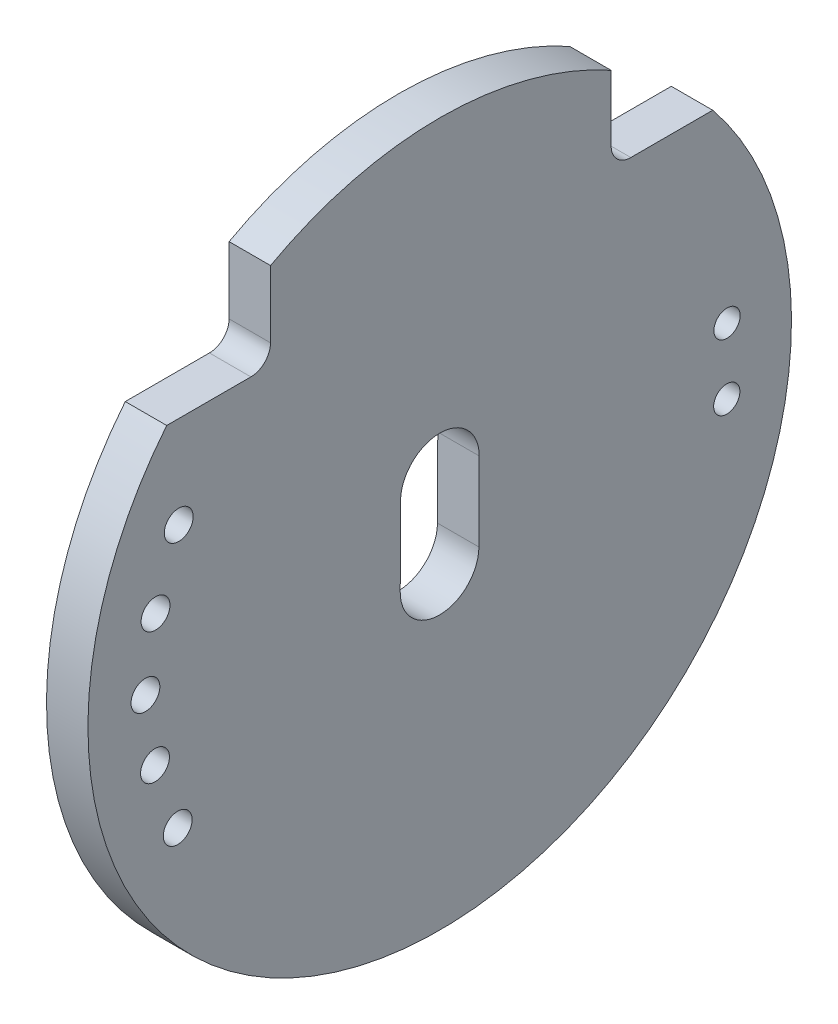
ISO-10303-21;
HEADER;
FILE_DESCRIPTION(('STEP AP214'),'2;1');
FILE_NAME('part.step','',(''),(''),'','','');
FILE_SCHEMA(('AUTOMOTIVE_DESIGN { 1 0 10303 214 1 1 1 1 }'));
ENDSEC;
DATA;
#1=APPLICATION_CONTEXT('core data for automotive mechanical design processes');
#2=APPLICATION_PROTOCOL_DEFINITION('international standard','automotive_design',2000,#1);
#3=PRODUCT_CONTEXT('',#1,'mechanical');
#4=PRODUCT('Part','Part','',(#3));
#5=PRODUCT_RELATED_PRODUCT_CATEGORY('part','',(#4));
#6=PRODUCT_DEFINITION_FORMATION('','',#4);
#7=PRODUCT_DEFINITION_CONTEXT('part definition',#1,'design');
#8=PRODUCT_DEFINITION('design','',#6,#7);
#9=PRODUCT_DEFINITION_SHAPE('','',#8);
#10=(LENGTH_UNIT() NAMED_UNIT(*) SI_UNIT(.MILLI.,.METRE.));
#11=(NAMED_UNIT(*) PLANE_ANGLE_UNIT() SI_UNIT($,.RADIAN.));
#12=(NAMED_UNIT(*) SI_UNIT($,.STERADIAN.) SOLID_ANGLE_UNIT());
#13=UNCERTAINTY_MEASURE_WITH_UNIT(LENGTH_MEASURE(1.E-05),#10,'distance_accuracy_value','');
#14=(GEOMETRIC_REPRESENTATION_CONTEXT(3) GLOBAL_UNCERTAINTY_ASSIGNED_CONTEXT((#13)) GLOBAL_UNIT_ASSIGNED_CONTEXT((#10,
#11,#12)) REPRESENTATION_CONTEXT('',''));
#15=CARTESIAN_POINT('',(0.,0.,0.));
#16=DIRECTION('',(0.,0.,1.));
#17=DIRECTION('',(1.,0.,0.));
#18=AXIS2_PLACEMENT_3D('',#15,#16,#17);
#19=CARTESIAN_POINT('',(0.,7.12627906861784,-7.18724294493581));
#20=DIRECTION('',(1.,0.,0.));
#21=DIRECTION('',(0.,0.135231072620531,-0.990814088009401));
#22=AXIS2_PLACEMENT_3D('',#19,#20,#21);
#23=PLANE('',#22);
#24=CARTESIAN_POINT('',(0.,2.5138076662489,5.05504994051893));
#25=DIRECTION('',(-1.,0.,0.));
#26=DIRECTION('',(0.,-0.135231072620531,0.990814088009401));
#27=AXIS2_PLACEMENT_3D('',#24,#25,#26);
#28=CIRCLE('',#27,0.2794);
#29=CARTESIAN_POINT('',(0.,2.47602410455872,5.33188339670876));
#30=VERTEX_POINT('',#29);
#31=EDGE_CURVE('E157',#30,#30,#28,.T.);
#32=ORIENTED_EDGE('',*,*,#31,.T.);
#33=EDGE_LOOP('',(#32));
#34=FACE_BOUND('',#33,.T.);
#35=CARTESIAN_POINT('',(0.,-0.682532004767782,-5.55992778572417));
#36=DIRECTION('',(-1.,0.,0.));
#37=DIRECTION('',(0.,-0.135231072620531,0.990814088009401));
#38=AXIS2_PLACEMENT_3D('',#35,#36,#37);
#39=CIRCLE('',#38,0.254);
#40=CARTESIAN_POINT('',(0.,-0.716880697213397,-5.30826100736978));
#41=VERTEX_POINT('',#40);
#42=EDGE_CURVE('E154',#41,#41,#39,.T.);
#43=ORIENTED_EDGE('',*,*,#42,.T.);
#44=EDGE_LOOP('',(#43));
#45=FACE_BOUND('',#44,.T.);
#46=CARTESIAN_POINT('',(0.,0.58745793827718,-5.56498194882563));
#47=DIRECTION('',(-1.,0.,0.));
#48=DIRECTION('',(0.,-0.135231072620531,0.990814088009401));
#49=AXIS2_PLACEMENT_3D('',#46,#47,#48);
#50=CIRCLE('',#49,0.254);
#51=CARTESIAN_POINT('',(0.,0.553109245831565,-5.31331517047124));
#52=VERTEX_POINT('',#51);
#53=EDGE_CURVE('E151',#52,#52,#50,.T.);
#54=ORIENTED_EDGE('',*,*,#53,.T.);
#55=EDGE_LOOP('',(#54));
#56=FACE_BOUND('',#55,.T.);
#57=CARTESIAN_POINT('',(0.,1.25193663000467,5.50457531287063));
#58=DIRECTION('',(-1.,0.,0.));
#59=DIRECTION('',(0.,-0.135231072620531,0.990814088009401));
#60=AXIS2_PLACEMENT_3D('',#57,#58,#59);
#61=CIRCLE('',#60,0.2794);
#62=CARTESIAN_POINT('',(0.,1.21415306831449,5.78140876906046));
#63=VERTEX_POINT('',#62);
#64=EDGE_CURVE('E148',#63,#63,#61,.T.);
#65=ORIENTED_EDGE('',*,*,#64,.T.);
#66=EDGE_LOOP('',(#65));
#67=FACE_BOUND('',#66,.T.);
#68=CARTESIAN_POINT('',(0.,-0.0172951885750744,5.70012796742883));
#69=DIRECTION('',(-1.,0.,0.));
#70=DIRECTION('',(0.,-0.135231072620531,0.990814088009401));
#71=AXIS2_PLACEMENT_3D('',#68,#69,#70);
#72=CIRCLE('',#71,0.2794);
#73=CARTESIAN_POINT('',(0.,-0.0550787502652509,5.97696142361866));
#74=VERTEX_POINT('',#73);
#75=EDGE_CURVE('E145',#74,#74,#72,.T.);
#76=ORIENTED_EDGE('',*,*,#75,.T.);
#77=EDGE_LOOP('',(#76));
#78=FACE_BOUND('',#77,.T.);
#79=CARTESIAN_POINT('',(0.,-2.55980215621573,5.07524132210927));
#80=DIRECTION('',(-1.,0.,0.));
#81=DIRECTION('',(0.,-0.135231072620531,0.990814088009401));
#82=AXIS2_PLACEMENT_3D('',#79,#80,#81);
#83=CIRCLE('',#82,0.2794);
#84=CARTESIAN_POINT('',(0.,-2.59758571790591,5.3520747782991));
#85=VERTEX_POINT('',#84);
#86=EDGE_CURVE('E142',#85,#85,#83,.T.);
#87=ORIENTED_EDGE('',*,*,#86,.T.);
#88=EDGE_LOOP('',(#87));
#89=FACE_BOUND('',#88,.T.);
#90=CARTESIAN_POINT('',(0.,-1.28804325608525,5.51468363907355));
#91=DIRECTION('',(-1.,0.,0.));
#92=DIRECTION('',(0.,-0.135231072620531,0.990814088009401));
#93=AXIS2_PLACEMENT_3D('',#90,#91,#92);
#94=CIRCLE('',#93,0.2794);
#95=CARTESIAN_POINT('',(0.,-1.32582681777543,5.79151709526338));
#96=VERTEX_POINT('',#95);
#97=EDGE_CURVE('E139',#96,#96,#94,.T.);
#98=ORIENTED_EDGE('',*,*,#97,.T.);
#99=EDGE_LOOP('',(#98));
#100=FACE_BOUND('',#99,.T.);
#101=CARTESIAN_POINT('',(0.,-0.761993965826976,0.00303249786087756));
#102=DIRECTION('',(-1.,0.,0.));
#103=DIRECTION('',(0.,-0.135231072620531,0.990814088009401));
#104=AXIS2_PLACEMENT_3D('',#101,#102,#103);
#105=CIRCLE('',#104,0.762);
#106=CARTESIAN_POINT('',(0.,-0.765026463687854,-0.758961467966099));
#107=VERTEX_POINT('',#106);
#108=CARTESIAN_POINT('',(0.,-0.758961467966099,0.765026463687854));
#109=VERTEX_POINT('',#108);
#110=EDGE_CURVE('E124',#107,#109,#105,.T.);
#111=ORIENTED_EDGE('',*,*,#110,.T.);
#112=DIRECTION('',(0.,0.999992081137765,-0.00397965598540282));
#113=VECTOR('',#112,1.);
#114=CARTESIAN_POINT('',(0.,0.803129311954259,0.758809830537141));
#115=LINE('',#114,#113);
#116=CARTESIAN_POINT('',(0.,0.765026463687856,0.758961467966101));
#117=VERTEX_POINT('',#116);
#118=EDGE_CURVE('E203',#117,#109,#115,.F.);
#119=ORIENTED_EDGE('',*,*,#118,.F.);
#120=CARTESIAN_POINT('',(0.,0.761993965826978,-0.00303249786087713));
#121=DIRECTION('',(-1.,0.,0.));
#122=DIRECTION('',(0.,-0.135231072620531,0.990814088009401));
#123=AXIS2_PLACEMENT_3D('',#120,#121,#122);
#124=CIRCLE('',#123,0.762);
#125=CARTESIAN_POINT('',(0.,0.758961467966101,-0.765026463687852));
#126=VERTEX_POINT('',#125);
#127=EDGE_CURVE('E161',#117,#126,#124,.T.);
#128=ORIENTED_EDGE('',*,*,#127,.T.);
#129=DIRECTION('',(0.,-0.999992081137765,0.00397965598540284));
#130=VECTOR('',#129,1.);
#131=CARTESIAN_POINT('',(0.,-0.803129311954257,-0.758809830537139));
#132=LINE('',#131,#130);
#133=EDGE_CURVE('E164',#107,#126,#132,.F.);
#134=ORIENTED_EDGE('',*,*,#133,.F.);
#135=EDGE_LOOP('',(#111,#119,#128,#134));
#136=FACE_BOUND('',#135,.T.);
#137=CARTESIAN_POINT('',(0.,0.,0.));
#138=DIRECTION('',(1.,0.,0.));
#139=DIRECTION('',(0.,0.,-1.));
#140=AXIS2_PLACEMENT_3D('',#137,#138,#139);
#141=CIRCLE('',#140,6.81392592);
#142=CARTESIAN_POINT('',(0.,4.29704157111282,5.28819630681163));
#143=VERTEX_POINT('',#142);
#144=CARTESIAN_POINT('',(0.,4.29704157111281,-5.28819630681163));
#145=VERTEX_POINT('',#144);
#146=EDGE_CURVE('E178',#143,#145,#141,.T.);
#147=ORIENTED_EDGE('',*,*,#146,.T.);
#148=DIRECTION('',(0.,0.,1.));
#149=VECTOR('',#148,1.);
#150=CARTESIAN_POINT('',(0.,4.29704157111281,-7.18724294493581));
#151=LINE('',#150,#149);
#152=CARTESIAN_POINT('',(0.,4.29704157111282,-3.70147208886825));
#153=VERTEX_POINT('',#152);
#154=EDGE_CURVE('E201',#145,#153,#151,.T.);
#155=ORIENTED_EDGE('',*,*,#154,.T.);
#156=CARTESIAN_POINT('',(0.,4.67804157111282,-3.70147208886825));
#157=DIRECTION('',(1.,0.,0.));
#158=DIRECTION('',(0.,0.,-1.));
#159=AXIS2_PLACEMENT_3D('',#156,#157,#158);
#160=CIRCLE('',#159,0.381);
#161=CARTESIAN_POINT('',(0.,4.67804157111282,-3.32047208886825));
#162=VERTEX_POINT('',#161);
#163=EDGE_CURVE('E11',#153,#162,#160,.F.);
#164=ORIENTED_EDGE('',*,*,#163,.T.);
#165=DIRECTION('',(0.,1.,0.));
#166=VECTOR('',#165,1.);
#167=CARTESIAN_POINT('',(0.,7.12627906861784,-3.32047208886825));
#168=LINE('',#167,#166);
#169=CARTESIAN_POINT('',(0.,5.95013038094921,-3.32047208886825));
#170=VERTEX_POINT('',#169);
#171=EDGE_CURVE('E204',#162,#170,#168,.T.);
#172=ORIENTED_EDGE('',*,*,#171,.T.);
#173=CARTESIAN_POINT('',(0.,0.,0.));
#174=DIRECTION('',(1.,0.,0.));
#175=DIRECTION('',(0.,0.,-1.));
#176=AXIS2_PLACEMENT_3D('',#173,#174,#175);
#177=CIRCLE('',#176,6.81392592);
#178=CARTESIAN_POINT('',(0.,5.97417912716733,3.27700628619568));
#179=VERTEX_POINT('',#178);
#180=EDGE_CURVE('E196',#170,#179,#177,.T.);
#181=ORIENTED_EDGE('',*,*,#180,.T.);
#182=DIRECTION('',(0.,-1.,0.));
#183=VECTOR('',#182,1.);
#184=CARTESIAN_POINT('',(0.,7.12627906861784,3.27700628619568));
#185=LINE('',#184,#183);
#186=CARTESIAN_POINT('',(0.,4.67804157111282,3.27700628619568));
#187=VERTEX_POINT('',#186);
#188=EDGE_CURVE('E193',#179,#187,#185,.T.);
#189=ORIENTED_EDGE('',*,*,#188,.T.);
#190=CARTESIAN_POINT('',(0.,4.67804157111282,3.65800628619568));
#191=DIRECTION('',(1.,0.,0.));
#192=DIRECTION('',(0.,0.,-1.));
#193=AXIS2_PLACEMENT_3D('',#190,#191,#192);
#194=CIRCLE('',#193,0.381);
#195=CARTESIAN_POINT('',(0.,4.29704157111282,3.65800628619568));
#196=VERTEX_POINT('',#195);
#197=EDGE_CURVE('E220',#187,#196,#194,.F.);
#198=ORIENTED_EDGE('',*,*,#197,.T.);
#199=DIRECTION('',(0.,0.,1.));
#200=VECTOR('',#199,1.);
#201=CARTESIAN_POINT('',(0.,4.29704157111282,-7.18724294493581));
#202=LINE('',#201,#200);
#203=EDGE_CURVE('E197',#196,#143,#202,.T.);
#204=ORIENTED_EDGE('',*,*,#203,.T.);
#205=EDGE_LOOP('',(#147,#155,#164,#172,#181,#189,#198,#204));
#206=FACE_BOUND('',#205,.T.);
#207=ADVANCED_FACE('F17',(#34,#45,#56,#67,#78,#89,#100,#136,#206),#23,.T.);
#208=CARTESIAN_POINT('',(-0.80264,7.12627906861784,-7.18724294493581));
#209=DIRECTION('',(1.,0.,0.));
#210=DIRECTION('',(0.,0.135231072620531,-0.990814088009401));
#211=AXIS2_PLACEMENT_3D('',#208,#209,#210);
#212=PLANE('',#211);
#213=CARTESIAN_POINT('',(-0.80264,0.761993965826978,-0.00303249786087713));
#214=DIRECTION('',(-1.,0.,0.));
#215=DIRECTION('',(0.,-0.135231072620531,0.990814088009401));
#216=AXIS2_PLACEMENT_3D('',#213,#214,#215);
#217=CIRCLE('',#216,0.762);
#218=CARTESIAN_POINT('',(-0.80264,0.765026463687855,0.758961467966101));
#219=VERTEX_POINT('',#218);
#220=CARTESIAN_POINT('',(-0.80264,0.7589614679661,-0.765026463687853));
#221=VERTEX_POINT('',#220);
#222=EDGE_CURVE('E116',#219,#221,#217,.T.);
#223=ORIENTED_EDGE('',*,*,#222,.F.);
#224=DIRECTION('',(0.,0.999992081137765,-0.00397965598540231));
#225=VECTOR('',#224,1.);
#226=CARTESIAN_POINT('',(-0.80264,-0.758961467966098,0.765026463687854));
#227=LINE('',#226,#225);
#228=CARTESIAN_POINT('',(-0.80264,-0.758961467966099,0.765026463687854));
#229=VERTEX_POINT('',#228);
#230=EDGE_CURVE('E129',#229,#219,#227,.T.);
#231=ORIENTED_EDGE('',*,*,#230,.F.);
#232=CARTESIAN_POINT('',(-0.80264,-0.761993965826976,0.00303249786087756));
#233=DIRECTION('',(-1.,0.,0.));
#234=DIRECTION('',(0.,-0.135231072620531,0.990814088009401));
#235=AXIS2_PLACEMENT_3D('',#232,#233,#234);
#236=CIRCLE('',#235,0.762);
#237=CARTESIAN_POINT('',(-0.80264,-0.765026463687854,-0.758961467966099));
#238=VERTEX_POINT('',#237);
#239=EDGE_CURVE('E115',#238,#229,#236,.T.);
#240=ORIENTED_EDGE('',*,*,#239,.F.);
#241=DIRECTION('',(0.,-0.999992081137765,0.00397965598540351));
#242=VECTOR('',#241,1.);
#243=CARTESIAN_POINT('',(-0.80264,0.7589614679661,-0.765026463687854));
#244=LINE('',#243,#242);
#245=EDGE_CURVE('E105',#221,#238,#244,.T.);
#246=ORIENTED_EDGE('',*,*,#245,.F.);
#247=EDGE_LOOP('',(#223,#231,#240,#246));
#248=FACE_BOUND('',#247,.T.);
#249=CARTESIAN_POINT('',(-0.80264,2.5138076662489,5.05504994051893));
#250=DIRECTION('',(-1.,0.,0.));
#251=DIRECTION('',(0.,-0.135231072620531,0.990814088009401));
#252=AXIS2_PLACEMENT_3D('',#249,#250,#251);
#253=CIRCLE('',#252,0.2794);
#254=CARTESIAN_POINT('',(-0.80264,2.47602410455872,5.33188339670876));
#255=VERTEX_POINT('',#254);
#256=EDGE_CURVE('E131',#255,#255,#253,.T.);
#257=ORIENTED_EDGE('',*,*,#256,.F.);
#258=EDGE_LOOP('',(#257));
#259=FACE_BOUND('',#258,.T.);
#260=CARTESIAN_POINT('',(-0.80264,-0.682532004767781,-5.55992778572417));
#261=DIRECTION('',(-1.,0.,0.));
#262=DIRECTION('',(0.,-0.135231072620531,0.990814088009401));
#263=AXIS2_PLACEMENT_3D('',#260,#261,#262);
#264=CIRCLE('',#263,0.254);
#265=CARTESIAN_POINT('',(-0.80264,-0.716880697213396,-5.30826100736978));
#266=VERTEX_POINT('',#265);
#267=EDGE_CURVE('E134',#266,#266,#264,.T.);
#268=ORIENTED_EDGE('',*,*,#267,.F.);
#269=EDGE_LOOP('',(#268));
#270=FACE_BOUND('',#269,.T.);
#271=CARTESIAN_POINT('',(-0.80264,0.587457938277179,-5.56498194882563));
#272=DIRECTION('',(-1.,0.,0.));
#273=DIRECTION('',(0.,-0.135231072620531,0.990814088009401));
#274=AXIS2_PLACEMENT_3D('',#271,#272,#273);
#275=CIRCLE('',#274,0.254);
#276=CARTESIAN_POINT('',(-0.80264,0.553109245831564,-5.31331517047124));
#277=VERTEX_POINT('',#276);
#278=EDGE_CURVE('E468',#277,#277,#275,.T.);
#279=ORIENTED_EDGE('',*,*,#278,.F.);
#280=EDGE_LOOP('',(#279));
#281=FACE_BOUND('',#280,.T.);
#282=CARTESIAN_POINT('',(-0.80264,1.25193663000467,5.50457531287063));
#283=DIRECTION('',(-1.,0.,0.));
#284=DIRECTION('',(0.,-0.135231072620531,0.990814088009401));
#285=AXIS2_PLACEMENT_3D('',#282,#283,#284);
#286=CIRCLE('',#285,0.2794);
#287=CARTESIAN_POINT('',(-0.80264,1.21415306831449,5.78140876906046));
#288=VERTEX_POINT('',#287);
#289=EDGE_CURVE('E465',#288,#288,#286,.T.);
#290=ORIENTED_EDGE('',*,*,#289,.F.);
#291=EDGE_LOOP('',(#290));
#292=FACE_BOUND('',#291,.T.);
#293=CARTESIAN_POINT('',(-0.80264,-0.0172951885750754,5.70012796742883));
#294=DIRECTION('',(-1.,0.,0.));
#295=DIRECTION('',(0.,-0.135231072620531,0.990814088009401));
#296=AXIS2_PLACEMENT_3D('',#293,#294,#295);
#297=CIRCLE('',#296,0.2794);
#298=CARTESIAN_POINT('',(-0.80264,-0.0550787502652518,5.97696142361866));
#299=VERTEX_POINT('',#298);
#300=EDGE_CURVE('E462',#299,#299,#297,.T.);
#301=ORIENTED_EDGE('',*,*,#300,.F.);
#302=EDGE_LOOP('',(#301));
#303=FACE_BOUND('',#302,.T.);
#304=CARTESIAN_POINT('',(-0.80264,-2.55980215621573,5.07524132210927));
#305=DIRECTION('',(-1.,0.,0.));
#306=DIRECTION('',(0.,-0.135231072620531,0.990814088009401));
#307=AXIS2_PLACEMENT_3D('',#304,#305,#306);
#308=CIRCLE('',#307,0.2794);
#309=CARTESIAN_POINT('',(-0.80264,-2.59758571790591,5.3520747782991));
#310=VERTEX_POINT('',#309);
#311=EDGE_CURVE('E459',#310,#310,#308,.T.);
#312=ORIENTED_EDGE('',*,*,#311,.F.);
#313=EDGE_LOOP('',(#312));
#314=FACE_BOUND('',#313,.T.);
#315=CARTESIAN_POINT('',(-0.80264,-1.28804325608525,5.51468363907355));
#316=DIRECTION('',(-1.,0.,0.));
#317=DIRECTION('',(0.,-0.135231072620531,0.990814088009401));
#318=AXIS2_PLACEMENT_3D('',#315,#316,#317);
#319=CIRCLE('',#318,0.2794);
#320=CARTESIAN_POINT('',(-0.80264,-1.32582681777543,5.79151709526338));
#321=VERTEX_POINT('',#320);
#322=EDGE_CURVE('E212',#321,#321,#319,.T.);
#323=ORIENTED_EDGE('',*,*,#322,.F.);
#324=EDGE_LOOP('',(#323));
#325=FACE_BOUND('',#324,.T.);
#326=DIRECTION('',(0.,-1.,0.));
#327=VECTOR('',#326,1.);
#328=CARTESIAN_POINT('',(-0.80264,4.04304157111282,-3.32047208886825));
#329=LINE('',#328,#327);
#330=CARTESIAN_POINT('',(-0.80264,5.95013038094921,-3.32047208886825));
#331=VERTEX_POINT('',#330);
#332=CARTESIAN_POINT('',(-0.80264,4.67804157111282,-3.32047208886825));
#333=VERTEX_POINT('',#332);
#334=EDGE_CURVE('E176',#331,#333,#329,.T.);
#335=ORIENTED_EDGE('',*,*,#334,.T.);
#336=CARTESIAN_POINT('',(-0.80264,4.67804157111282,-3.70147208886825));
#337=DIRECTION('',(1.,0.,0.));
#338=DIRECTION('',(0.,0.,-1.));
#339=AXIS2_PLACEMENT_3D('',#336,#337,#338);
#340=CIRCLE('',#339,0.381);
#341=CARTESIAN_POINT('',(-0.80264,4.29704157111282,-3.70147208886825));
#342=VERTEX_POINT('',#341);
#343=EDGE_CURVE('E25',#333,#342,#340,.T.);
#344=ORIENTED_EDGE('',*,*,#343,.T.);
#345=DIRECTION('',(0.,0.,-1.));
#346=VECTOR('',#345,1.);
#347=CARTESIAN_POINT('',(-0.80264,4.29704157111282,-3.06647208886825));
#348=LINE('',#347,#346);
#349=CARTESIAN_POINT('',(-0.80264,4.29704157111281,-5.28819630681163));
#350=VERTEX_POINT('',#349);
#351=EDGE_CURVE('E186',#342,#350,#348,.T.);
#352=ORIENTED_EDGE('',*,*,#351,.T.);
#353=CARTESIAN_POINT('',(-0.80264,0.,0.));
#354=DIRECTION('',(1.,0.,0.));
#355=DIRECTION('',(0.,0.,-1.));
#356=AXIS2_PLACEMENT_3D('',#353,#354,#355);
#357=CIRCLE('',#356,6.81392592);
#358=CARTESIAN_POINT('',(-0.80264,4.29704157111282,5.28819630681163));
#359=VERTEX_POINT('',#358);
#360=EDGE_CURVE('E188',#350,#359,#357,.F.);
#361=ORIENTED_EDGE('',*,*,#360,.T.);
#362=DIRECTION('',(0.,0.,-1.));
#363=VECTOR('',#362,1.);
#364=CARTESIAN_POINT('',(-0.80264,4.29704157111282,3.02300628619568));
#365=LINE('',#364,#363);
#366=CARTESIAN_POINT('',(-0.80264,4.29704157111282,3.65800628619568));
#367=VERTEX_POINT('',#366);
#368=EDGE_CURVE('E182',#359,#367,#365,.T.);
#369=ORIENTED_EDGE('',*,*,#368,.T.);
#370=CARTESIAN_POINT('',(-0.80264,4.67804157111282,3.65800628619568));
#371=DIRECTION('',(1.,0.,0.));
#372=DIRECTION('',(0.,0.,-1.));
#373=AXIS2_PLACEMENT_3D('',#370,#371,#372);
#374=CIRCLE('',#373,0.381);
#375=CARTESIAN_POINT('',(-0.80264,4.67804157111282,3.27700628619568));
#376=VERTEX_POINT('',#375);
#377=EDGE_CURVE('E218',#367,#376,#374,.T.);
#378=ORIENTED_EDGE('',*,*,#377,.T.);
#379=DIRECTION('',(0.,1.,0.));
#380=VECTOR('',#379,1.);
#381=CARTESIAN_POINT('',(-0.80264,5.82186061921009,3.27700628619568));
#382=LINE('',#381,#380);
#383=CARTESIAN_POINT('',(-0.80264,5.97417912716733,3.27700628619568));
#384=VERTEX_POINT('',#383);
#385=EDGE_CURVE('E179',#376,#384,#382,.T.);
#386=ORIENTED_EDGE('',*,*,#385,.T.);
#387=CARTESIAN_POINT('',(-0.80264,0.,0.));
#388=DIRECTION('',(1.,0.,0.));
#389=DIRECTION('',(0.,0.,-1.));
#390=AXIS2_PLACEMENT_3D('',#387,#388,#389);
#391=CIRCLE('',#390,6.81392592);
#392=EDGE_CURVE('E181',#384,#331,#391,.F.);
#393=ORIENTED_EDGE('',*,*,#392,.T.);
#394=EDGE_LOOP('',(#335,#344,#352,#361,#369,#378,#386,#393));
#395=FACE_BOUND('',#394,.T.);
#396=ADVANCED_FACE('F127',(#248,#259,#270,#281,#292,#303,#314,#325,#395),#212,.F.);
#397=CARTESIAN_POINT('',(0.0200691499999978,0.803129311954259,0.758809830537141));
#398=DIRECTION('',(0.,-0.00397965598540282,-0.999992081137765));
#399=DIRECTION('',(0.,0.999992081137765,-0.00397965598540282));
#400=AXIS2_PLACEMENT_3D('',#397,#398,#399);
#401=PLANE('',#400);
#402=ORIENTED_EDGE('',*,*,#118,.T.);
#403=DIRECTION('',(-1.,0.,0.));
#404=VECTOR('',#403,1.);
#405=CARTESIAN_POINT('',(0.020070133858267,-0.758961467966099,0.765026463687854));
#406=LINE('',#405,#404);
#407=EDGE_CURVE('E125',#109,#229,#406,.T.);
#408=ORIENTED_EDGE('',*,*,#407,.T.);
#409=ORIENTED_EDGE('',*,*,#230,.T.);
#410=DIRECTION('',(-1.,0.,0.));
#411=VECTOR('',#410,1.);
#412=CARTESIAN_POINT('',(0.020070133858267,0.765026463687856,0.758961467966101));
#413=LINE('',#412,#411);
#414=EDGE_CURVE('E165',#219,#117,#413,.F.);
#415=ORIENTED_EDGE('',*,*,#414,.T.);
#416=EDGE_LOOP('',(#402,#408,#409,#415));
#417=FACE_BOUND('',#416,.T.);
#418=ADVANCED_FACE('F267',(#417),#401,.T.);
#419=CARTESIAN_POINT('',(0.0200691499999978,-0.803129311954257,-0.758809830537139));
#420=DIRECTION('',(0.,0.00397965598540284,0.999992081137765));
#421=DIRECTION('',(0.,-0.999992081137765,0.00397965598540284));
#422=AXIS2_PLACEMENT_3D('',#419,#420,#421);
#423=PLANE('',#422);
#424=ORIENTED_EDGE('',*,*,#133,.T.);
#425=DIRECTION('',(1.,0.,0.));
#426=VECTOR('',#425,1.);
#427=CARTESIAN_POINT('',(0.0200691499999978,0.7589614679661,-0.765026463687853));
#428=LINE('',#427,#426);
#429=EDGE_CURVE('E110',#126,#221,#428,.F.);
#430=ORIENTED_EDGE('',*,*,#429,.T.);
#431=ORIENTED_EDGE('',*,*,#245,.T.);
#432=DIRECTION('',(-1.,0.,0.));
#433=VECTOR('',#432,1.);
#434=CARTESIAN_POINT('',(0.020070133858267,-0.765026463687853,-0.758961467966099));
#435=LINE('',#434,#433);
#436=EDGE_CURVE('E108',#238,#107,#435,.F.);
#437=ORIENTED_EDGE('',*,*,#436,.T.);
#438=EDGE_LOOP('',(#424,#430,#431,#437));
#439=FACE_BOUND('',#438,.T.);
#440=ADVANCED_FACE('F107',(#439),#423,.T.);
#441=CARTESIAN_POINT('',(0.020070133858267,0.761993965826978,-0.00303249786087713));
#442=DIRECTION('',(-1.,0.,0.));
#443=DIRECTION('',(0.,-0.135231072620531,0.990814088009401));
#444=AXIS2_PLACEMENT_3D('',#441,#442,#443);
#445=CYLINDRICAL_SURFACE('',#444,0.762);
#446=ORIENTED_EDGE('',*,*,#414,.F.);
#447=ORIENTED_EDGE('',*,*,#222,.T.);
#448=ORIENTED_EDGE('',*,*,#429,.F.);
#449=ORIENTED_EDGE('',*,*,#127,.F.);
#450=EDGE_LOOP('',(#446,#447,#448,#449));
#451=FACE_BOUND('',#450,.T.);
#452=ADVANCED_FACE('F279',(#451),#445,.F.);
#453=CARTESIAN_POINT('',(0.020070133858267,-0.761993965826976,0.00303249786087756));
#454=DIRECTION('',(-1.,0.,0.));
#455=DIRECTION('',(0.,-0.135231072620531,0.990814088009401));
#456=AXIS2_PLACEMENT_3D('',#453,#454,#455);
#457=CYLINDRICAL_SURFACE('',#456,0.762);
#458=ORIENTED_EDGE('',*,*,#436,.F.);
#459=ORIENTED_EDGE('',*,*,#239,.T.);
#460=ORIENTED_EDGE('',*,*,#407,.F.);
#461=ORIENTED_EDGE('',*,*,#110,.F.);
#462=EDGE_LOOP('',(#458,#459,#460,#461));
#463=FACE_BOUND('',#462,.T.);
#464=ADVANCED_FACE('F121',(#463),#457,.F.);
#465=CARTESIAN_POINT('',(0.0200772741589112,2.5138076662489,5.05504994051893));
#466=DIRECTION('',(-1.,0.,0.));
#467=DIRECTION('',(0.,-0.135231072620531,0.990814088009401));
#468=AXIS2_PLACEMENT_3D('',#465,#466,#467);
#469=CYLINDRICAL_SURFACE('',#468,0.2794);
#470=ORIENTED_EDGE('',*,*,#256,.T.);
#471=EDGE_LOOP('',(#470));
#472=FACE_BOUND('',#471,.T.);
#473=ORIENTED_EDGE('',*,*,#31,.F.);
#474=EDGE_LOOP('',(#473));
#475=FACE_BOUND('',#474,.T.);
#476=ADVANCED_FACE('F359',(#472,#475),#469,.F.);
#477=CARTESIAN_POINT('',(0.0200784015748027,-0.682532004767782,-5.55992778572417));
#478=DIRECTION('',(-1.,0.,0.));
#479=DIRECTION('',(0.,-0.135231072620531,0.990814088009401));
#480=AXIS2_PLACEMENT_3D('',#477,#478,#479);
#481=CYLINDRICAL_SURFACE('',#480,0.254);
#482=ORIENTED_EDGE('',*,*,#267,.T.);
#483=EDGE_LOOP('',(#482));
#484=FACE_BOUND('',#483,.T.);
#485=ORIENTED_EDGE('',*,*,#42,.F.);
#486=EDGE_LOOP('',(#485));
#487=FACE_BOUND('',#486,.T.);
#488=ADVANCED_FACE('F367',(#484,#487),#481,.F.);
#489=CARTESIAN_POINT('',(0.0200784015748027,0.58745793827718,-5.56498194882563));
#490=DIRECTION('',(-1.,0.,0.));
#491=DIRECTION('',(0.,-0.135231072620531,0.990814088009401));
#492=AXIS2_PLACEMENT_3D('',#489,#490,#491);
#493=CYLINDRICAL_SURFACE('',#492,0.254);
#494=ORIENTED_EDGE('',*,*,#278,.T.);
#495=EDGE_LOOP('',(#494));
#496=FACE_BOUND('',#495,.T.);
#497=ORIENTED_EDGE('',*,*,#53,.F.);
#498=EDGE_LOOP('',(#497));
#499=FACE_BOUND('',#498,.T.);
#500=ADVANCED_FACE('F376',(#496,#499),#493,.F.);
#501=CARTESIAN_POINT('',(0.0200772741589129,1.25193663000467,5.50457531287063));
#502=DIRECTION('',(-1.,0.,0.));
#503=DIRECTION('',(0.,-0.135231072620531,0.990814088009401));
#504=AXIS2_PLACEMENT_3D('',#501,#502,#503);
#505=CYLINDRICAL_SURFACE('',#504,0.2794);
#506=ORIENTED_EDGE('',*,*,#289,.T.);
#507=EDGE_LOOP('',(#506));
#508=FACE_BOUND('',#507,.T.);
#509=ORIENTED_EDGE('',*,*,#64,.F.);
#510=EDGE_LOOP('',(#509));
#511=FACE_BOUND('',#510,.T.);
#512=ADVANCED_FACE('F385',(#508,#511),#505,.F.);
#513=CARTESIAN_POINT('',(0.0200772741589094,-0.0172951885750744,5.70012796742883));
#514=DIRECTION('',(-1.,0.,0.));
#515=DIRECTION('',(0.,-0.135231072620531,0.990814088009401));
#516=AXIS2_PLACEMENT_3D('',#513,#514,#515);
#517=CYLINDRICAL_SURFACE('',#516,0.2794);
#518=ORIENTED_EDGE('',*,*,#300,.T.);
#519=EDGE_LOOP('',(#518));
#520=FACE_BOUND('',#519,.T.);
#521=ORIENTED_EDGE('',*,*,#75,.F.);
#522=EDGE_LOOP('',(#521));
#523=FACE_BOUND('',#522,.T.);
#524=ADVANCED_FACE('F394',(#520,#523),#517,.F.);
#525=CARTESIAN_POINT('',(0.0200772741589112,-2.55980215621573,5.07524132210927));
#526=DIRECTION('',(-1.,0.,0.));
#527=DIRECTION('',(0.,-0.135231072620531,0.990814088009401));
#528=AXIS2_PLACEMENT_3D('',#525,#526,#527);
#529=CYLINDRICAL_SURFACE('',#528,0.2794);
#530=ORIENTED_EDGE('',*,*,#311,.T.);
#531=EDGE_LOOP('',(#530));
#532=FACE_BOUND('',#531,.T.);
#533=ORIENTED_EDGE('',*,*,#86,.F.);
#534=EDGE_LOOP('',(#533));
#535=FACE_BOUND('',#534,.T.);
#536=ADVANCED_FACE('F403',(#532,#535),#529,.F.);
#537=CARTESIAN_POINT('',(0.0200772741589112,-1.28804325608525,5.51468363907355));
#538=DIRECTION('',(-1.,0.,0.));
#539=DIRECTION('',(0.,-0.135231072620531,0.990814088009401));
#540=AXIS2_PLACEMENT_3D('',#537,#538,#539);
#541=CYLINDRICAL_SURFACE('',#540,0.2794);
#542=ORIENTED_EDGE('',*,*,#322,.T.);
#543=EDGE_LOOP('',(#542));
#544=FACE_BOUND('',#543,.T.);
#545=ORIENTED_EDGE('',*,*,#97,.F.);
#546=EDGE_LOOP('',(#545));
#547=FACE_BOUND('',#546,.T.);
#548=ADVANCED_FACE('F278',(#544,#547),#541,.F.);
#549=CARTESIAN_POINT('',(1.73736,4.29704157111282,-3.06647208886825));
#550=DIRECTION('',(0.,1.,0.));
#551=DIRECTION('',(0.,0.,1.));
#552=AXIS2_PLACEMENT_3D('',#549,#550,#551);
#553=PLANE('',#552);
#554=ORIENTED_EDGE('',*,*,#351,.F.);
#555=DIRECTION('',(-1.,0.,0.));
#556=VECTOR('',#555,1.);
#557=CARTESIAN_POINT('',(0.,4.29704157111282,-3.70147208886825));
#558=LINE('',#557,#556);
#559=EDGE_CURVE('E32',#342,#153,#558,.F.);
#560=ORIENTED_EDGE('',*,*,#559,.T.);
#561=ORIENTED_EDGE('',*,*,#154,.F.);
#562=DIRECTION('',(-1.,0.,0.));
#563=VECTOR('',#562,1.);
#564=CARTESIAN_POINT('',(0.,4.29704157111281,-5.28819630681163));
#565=LINE('',#564,#563);
#566=EDGE_CURVE('E173',#145,#350,#565,.T.);
#567=ORIENTED_EDGE('',*,*,#566,.T.);
#568=EDGE_LOOP('',(#554,#560,#561,#567));
#569=FACE_BOUND('',#568,.T.);
#570=ADVANCED_FACE('F248',(#569),#553,.T.);
#571=CARTESIAN_POINT('',(1.73736,4.04304157111282,-3.32047208886825));
#572=DIRECTION('',(0.,0.,-1.));
#573=DIRECTION('',(-1.,0.,0.));
#574=AXIS2_PLACEMENT_3D('',#571,#572,#573);
#575=PLANE('',#574);
#576=ORIENTED_EDGE('',*,*,#171,.F.);
#577=DIRECTION('',(-1.,0.,0.));
#578=VECTOR('',#577,1.);
#579=CARTESIAN_POINT('',(-0.80264,4.67804157111282,-3.32047208886825));
#580=LINE('',#579,#578);
#581=EDGE_CURVE('E214',#162,#333,#580,.T.);
#582=ORIENTED_EDGE('',*,*,#581,.T.);
#583=ORIENTED_EDGE('',*,*,#334,.F.);
#584=DIRECTION('',(-1.,0.,0.));
#585=VECTOR('',#584,1.);
#586=CARTESIAN_POINT('',(0.,5.95013038094921,-3.32047208886825));
#587=LINE('',#586,#585);
#588=EDGE_CURVE('E169',#170,#331,#587,.T.);
#589=ORIENTED_EDGE('',*,*,#588,.F.);
#590=EDGE_LOOP('',(#576,#582,#583,#589));
#591=FACE_BOUND('',#590,.T.);
#592=ADVANCED_FACE('F244',(#591),#575,.T.);
#593=CARTESIAN_POINT('',(1.73736,0.,0.));
#594=DIRECTION('',(-1.,0.,0.));
#595=DIRECTION('',(0.,0.,1.));
#596=AXIS2_PLACEMENT_3D('',#593,#594,#595);
#597=CYLINDRICAL_SURFACE('',#596,6.81392592);
#598=ORIENTED_EDGE('',*,*,#588,.T.);
#599=ORIENTED_EDGE('',*,*,#392,.F.);
#600=DIRECTION('',(-1.,0.,0.));
#601=VECTOR('',#600,1.);
#602=CARTESIAN_POINT('',(0.,5.97417912716733,3.27700628619568));
#603=LINE('',#602,#601);
#604=EDGE_CURVE('E166',#179,#384,#603,.T.);
#605=ORIENTED_EDGE('',*,*,#604,.F.);
#606=ORIENTED_EDGE('',*,*,#180,.F.);
#607=EDGE_LOOP('',(#598,#599,#605,#606));
#608=FACE_BOUND('',#607,.T.);
#609=ADVANCED_FACE('F239',(#608),#597,.T.);
#610=CARTESIAN_POINT('',(1.73736,5.82186061921009,3.27700628619568));
#611=DIRECTION('',(0.,0.,1.));
#612=DIRECTION('',(0.,-1.,0.));
#613=AXIS2_PLACEMENT_3D('',#610,#611,#612);
#614=PLANE('',#613);
#615=ORIENTED_EDGE('',*,*,#385,.F.);
#616=DIRECTION('',(-1.,0.,0.));
#617=VECTOR('',#616,1.);
#618=CARTESIAN_POINT('',(0.,4.67804157111282,3.27700628619568));
#619=LINE('',#618,#617);
#620=EDGE_CURVE('E211',#376,#187,#619,.F.);
#621=ORIENTED_EDGE('',*,*,#620,.T.);
#622=ORIENTED_EDGE('',*,*,#188,.F.);
#623=ORIENTED_EDGE('',*,*,#604,.T.);
#624=EDGE_LOOP('',(#615,#621,#622,#623));
#625=FACE_BOUND('',#624,.T.);
#626=ADVANCED_FACE('F234',(#625),#614,.T.);
#627=CARTESIAN_POINT('',(1.73736,4.29704157111282,3.02300628619568));
#628=DIRECTION('',(0.,1.,0.));
#629=DIRECTION('',(0.,0.,1.));
#630=AXIS2_PLACEMENT_3D('',#627,#628,#629);
#631=PLANE('',#630);
#632=ORIENTED_EDGE('',*,*,#203,.F.);
#633=DIRECTION('',(-1.,0.,0.));
#634=VECTOR('',#633,1.);
#635=CARTESIAN_POINT('',(-0.80264,4.29704157111282,3.65800628619568));
#636=LINE('',#635,#634);
#637=EDGE_CURVE('E208',#196,#367,#636,.T.);
#638=ORIENTED_EDGE('',*,*,#637,.T.);
#639=ORIENTED_EDGE('',*,*,#368,.F.);
#640=DIRECTION('',(-1.,0.,0.));
#641=VECTOR('',#640,1.);
#642=CARTESIAN_POINT('',(0.,4.29704157111282,5.28819630681163));
#643=LINE('',#642,#641);
#644=EDGE_CURVE('E170',#143,#359,#643,.T.);
#645=ORIENTED_EDGE('',*,*,#644,.F.);
#646=EDGE_LOOP('',(#632,#638,#639,#645));
#647=FACE_BOUND('',#646,.T.);
#648=ADVANCED_FACE('F230',(#647),#631,.T.);
#649=CARTESIAN_POINT('',(1.73736,0.,0.));
#650=DIRECTION('',(-1.,0.,0.));
#651=DIRECTION('',(0.,0.,1.));
#652=AXIS2_PLACEMENT_3D('',#649,#650,#651);
#653=CYLINDRICAL_SURFACE('',#652,6.81392592);
#654=ORIENTED_EDGE('',*,*,#644,.T.);
#655=ORIENTED_EDGE('',*,*,#360,.F.);
#656=ORIENTED_EDGE('',*,*,#566,.F.);
#657=ORIENTED_EDGE('',*,*,#146,.F.);
#658=EDGE_LOOP('',(#654,#655,#656,#657));
#659=FACE_BOUND('',#658,.T.);
#660=ADVANCED_FACE('F251',(#659),#653,.T.);
#661=CARTESIAN_POINT('',(1.73736,4.67804157111282,3.65800628619568));
#662=DIRECTION('',(1.,0.,0.));
#663=DIRECTION('',(0.,0.,-1.));
#664=AXIS2_PLACEMENT_3D('',#661,#662,#663);
#665=CYLINDRICAL_SURFACE('',#664,0.381);
#666=ORIENTED_EDGE('',*,*,#197,.F.);
#667=ORIENTED_EDGE('',*,*,#620,.F.);
#668=ORIENTED_EDGE('',*,*,#377,.F.);
#669=ORIENTED_EDGE('',*,*,#637,.F.);
#670=EDGE_LOOP('',(#666,#667,#668,#669));
#671=FACE_BOUND('',#670,.T.);
#672=ADVANCED_FACE('F231',(#671),#665,.F.);
#673=CARTESIAN_POINT('',(1.73736,4.67804157111282,-3.70147208886825));
#674=DIRECTION('',(1.,0.,0.));
#675=DIRECTION('',(0.,0.,-1.));
#676=AXIS2_PLACEMENT_3D('',#673,#674,#675);
#677=CYLINDRICAL_SURFACE('',#676,0.381);
#678=ORIENTED_EDGE('',*,*,#163,.F.);
#679=ORIENTED_EDGE('',*,*,#559,.F.);
#680=ORIENTED_EDGE('',*,*,#343,.F.);
#681=ORIENTED_EDGE('',*,*,#581,.F.);
#682=EDGE_LOOP('',(#678,#679,#680,#681));
#683=FACE_BOUND('',#682,.T.);
#684=ADVANCED_FACE('F19',(#683),#677,.F.);
#685=CLOSED_SHELL('',(#207,#396,#418,#440,#452,#464,#476,#488,#500,#512,#524,#536,#548,#570,
#592,#609,#626,#648,#660,#672,#684));
#686=MANIFOLD_SOLID_BREP('B1',#685);
#687=ADVANCED_BREP_SHAPE_REPRESENTATION('',(#18,#686),#14);
#688=SHAPE_DEFINITION_REPRESENTATION(#9,#687);
ENDSEC;
END-ISO-10303-21;
